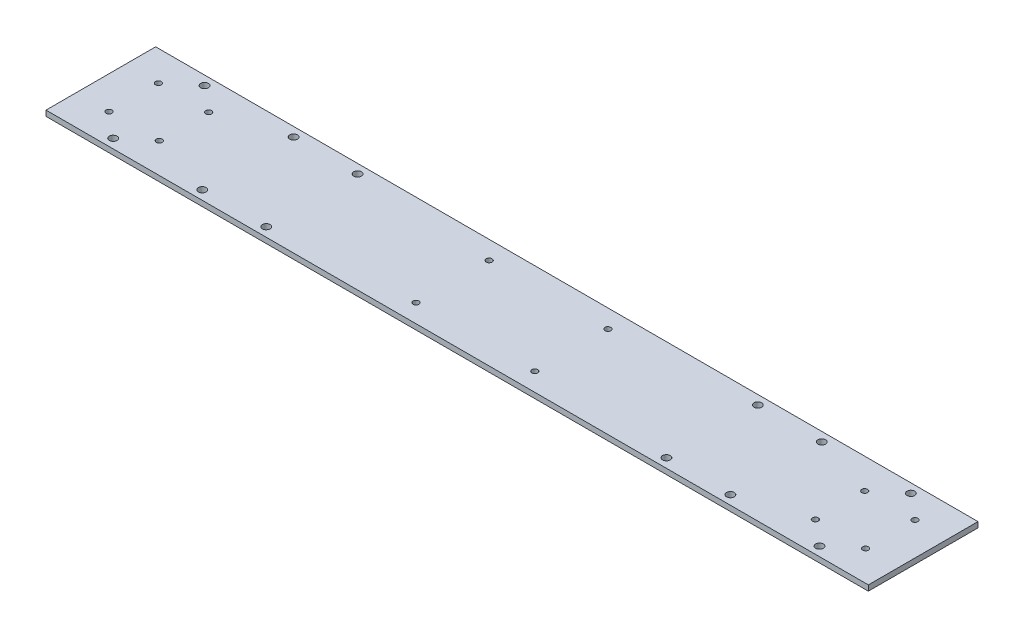
ISO-10303-21;
HEADER;
FILE_DESCRIPTION(('STEP AP214'),'2;1');
FILE_NAME('part.step','',(''),(''),'','','');
FILE_SCHEMA(('AUTOMOTIVE_DESIGN { 1 0 10303 214 1 1 1 1 }'));
ENDSEC;
DATA;
#1=APPLICATION_CONTEXT('core data for automotive mechanical design processes');
#2=APPLICATION_PROTOCOL_DEFINITION('international standard','automotive_design',2000,#1);
#3=PRODUCT_CONTEXT('',#1,'mechanical');
#4=PRODUCT('Part','Part','',(#3));
#5=PRODUCT_RELATED_PRODUCT_CATEGORY('part','',(#4));
#6=PRODUCT_DEFINITION_FORMATION('','',#4);
#7=PRODUCT_DEFINITION_CONTEXT('part definition',#1,'design');
#8=PRODUCT_DEFINITION('design','',#6,#7);
#9=PRODUCT_DEFINITION_SHAPE('','',#8);
#10=(LENGTH_UNIT() NAMED_UNIT(*) SI_UNIT(.MILLI.,.METRE.));
#11=(NAMED_UNIT(*) PLANE_ANGLE_UNIT() SI_UNIT($,.RADIAN.));
#12=(NAMED_UNIT(*) SI_UNIT($,.STERADIAN.) SOLID_ANGLE_UNIT());
#13=UNCERTAINTY_MEASURE_WITH_UNIT(LENGTH_MEASURE(1.E-05),#10,'distance_accuracy_value','');
#14=(GEOMETRIC_REPRESENTATION_CONTEXT(3) GLOBAL_UNCERTAINTY_ASSIGNED_CONTEXT((#13)) GLOBAL_UNIT_ASSIGNED_CONTEXT((#10,
#11,#12)) REPRESENTATION_CONTEXT('',''));
#15=CARTESIAN_POINT('',(0.,0.,0.));
#16=DIRECTION('',(0.,0.,1.));
#17=DIRECTION('',(1.,0.,0.));
#18=AXIS2_PLACEMENT_3D('',#15,#16,#17);
#19=CARTESIAN_POINT('',(0.,3.,-42.5));
#20=DIRECTION('',(0.,0.,-1.));
#21=DIRECTION('',(-1.,0.,0.));
#22=AXIS2_PLACEMENT_3D('',#19,#20,#21);
#23=PLANE('',#22);
#24=DIRECTION('',(1.,0.,0.));
#25=VECTOR('',#24,1.);
#26=CARTESIAN_POINT('',(0.,0.,-42.5));
#27=LINE('',#26,#25);
#28=CARTESIAN_POINT('',(-246.441364285791,0.,-42.5));
#29=VERTEX_POINT('',#28);
#30=CARTESIAN_POINT('',(203.558635714209,0.,-42.5));
#31=VERTEX_POINT('',#30);
#32=EDGE_CURVE('E103',#29,#31,#27,.T.);
#33=ORIENTED_EDGE('',*,*,#32,.T.);
#34=DIRECTION('',(0.,-1.,0.));
#35=VECTOR('',#34,1.);
#36=CARTESIAN_POINT('',(203.558635714209,3.,-42.5));
#37=LINE('',#36,#35);
#38=CARTESIAN_POINT('',(203.558635714209,3.,-42.5));
#39=VERTEX_POINT('',#38);
#40=EDGE_CURVE('E11',#39,#31,#37,.T.);
#41=ORIENTED_EDGE('',*,*,#40,.F.);
#42=DIRECTION('',(1.,0.,0.));
#43=VECTOR('',#42,1.);
#44=CARTESIAN_POINT('',(0.,3.,-42.5));
#45=LINE('',#44,#43);
#46=CARTESIAN_POINT('',(-246.441364285791,3.,-42.5));
#47=VERTEX_POINT('',#46);
#48=EDGE_CURVE('E88',#47,#39,#45,.T.);
#49=ORIENTED_EDGE('',*,*,#48,.F.);
#50=DIRECTION('',(0.,-1.,0.));
#51=VECTOR('',#50,1.);
#52=CARTESIAN_POINT('',(-246.441364285791,3.,-42.5));
#53=LINE('',#52,#51);
#54=EDGE_CURVE('E55',#47,#29,#53,.T.);
#55=ORIENTED_EDGE('',*,*,#54,.T.);
#56=EDGE_LOOP('',(#33,#41,#49,#55));
#57=FACE_BOUND('',#56,.T.);
#58=ADVANCED_FACE('F37',(#57),#23,.F.);
#59=CARTESIAN_POINT('',(203.558635714209,3.,0.));
#60=DIRECTION('',(-1.,0.,0.));
#61=DIRECTION('',(0.,0.,1.));
#62=AXIS2_PLACEMENT_3D('',#59,#60,#61);
#63=PLANE('',#62);
#64=DIRECTION('',(0.,0.,-1.));
#65=VECTOR('',#64,1.);
#66=CARTESIAN_POINT('',(203.558635714209,0.,0.));
#67=LINE('',#66,#65);
#68=CARTESIAN_POINT('',(203.558635714209,0.,-102.5));
#69=VERTEX_POINT('',#68);
#70=EDGE_CURVE('E93',#31,#69,#67,.T.);
#71=ORIENTED_EDGE('',*,*,#70,.T.);
#72=DIRECTION('',(0.,-1.,0.));
#73=VECTOR('',#72,1.);
#74=CARTESIAN_POINT('',(203.558635714209,3.,-102.5));
#75=LINE('',#74,#73);
#76=CARTESIAN_POINT('',(203.558635714209,3.,-102.5));
#77=VERTEX_POINT('',#76);
#78=EDGE_CURVE('E46',#77,#69,#75,.T.);
#79=ORIENTED_EDGE('',*,*,#78,.F.);
#80=DIRECTION('',(0.,0.,-1.));
#81=VECTOR('',#80,1.);
#82=CARTESIAN_POINT('',(203.558635714209,3.,0.));
#83=LINE('',#82,#81);
#84=EDGE_CURVE('E80',#39,#77,#83,.T.);
#85=ORIENTED_EDGE('',*,*,#84,.F.);
#86=ORIENTED_EDGE('',*,*,#40,.T.);
#87=EDGE_LOOP('',(#71,#79,#85,#86));
#88=FACE_BOUND('',#87,.T.);
#89=ADVANCED_FACE('F92',(#88),#63,.F.);
#90=CARTESIAN_POINT('',(0.,3.,-102.5));
#91=DIRECTION('',(0.,0.,-1.));
#92=DIRECTION('',(-1.,0.,0.));
#93=AXIS2_PLACEMENT_3D('',#90,#91,#92);
#94=PLANE('',#93);
#95=DIRECTION('',(1.,0.,0.));
#96=VECTOR('',#95,1.);
#97=CARTESIAN_POINT('',(0.,0.,-102.5));
#98=LINE('',#97,#96);
#99=CARTESIAN_POINT('',(-246.441364285791,0.,-102.5));
#100=VERTEX_POINT('',#99);
#101=EDGE_CURVE('E107',#100,#69,#98,.T.);
#102=ORIENTED_EDGE('',*,*,#101,.F.);
#103=DIRECTION('',(0.,-1.,0.));
#104=VECTOR('',#103,1.);
#105=CARTESIAN_POINT('',(-246.441364285791,3.,-102.5));
#106=LINE('',#105,#104);
#107=CARTESIAN_POINT('',(-246.441364285791,3.,-102.5));
#108=VERTEX_POINT('',#107);
#109=EDGE_CURVE('E69',#108,#100,#106,.T.);
#110=ORIENTED_EDGE('',*,*,#109,.F.);
#111=DIRECTION('',(1.,0.,0.));
#112=VECTOR('',#111,1.);
#113=CARTESIAN_POINT('',(0.,3.,-102.5));
#114=LINE('',#113,#112);
#115=EDGE_CURVE('E87',#108,#77,#114,.T.);
#116=ORIENTED_EDGE('',*,*,#115,.T.);
#117=ORIENTED_EDGE('',*,*,#78,.T.);
#118=EDGE_LOOP('',(#102,#110,#116,#117));
#119=FACE_BOUND('',#118,.T.);
#120=ADVANCED_FACE('F97',(#119),#94,.T.);
#121=CARTESIAN_POINT('',(-246.441364285791,3.,0.));
#122=DIRECTION('',(-1.,0.,0.));
#123=DIRECTION('',(0.,0.,1.));
#124=AXIS2_PLACEMENT_3D('',#121,#122,#123);
#125=PLANE('',#124);
#126=DIRECTION('',(0.,0.,-1.));
#127=VECTOR('',#126,1.);
#128=CARTESIAN_POINT('',(-246.441364285791,0.,0.));
#129=LINE('',#128,#127);
#130=EDGE_CURVE('E109',#29,#100,#129,.T.);
#131=ORIENTED_EDGE('',*,*,#130,.F.);
#132=ORIENTED_EDGE('',*,*,#54,.F.);
#133=DIRECTION('',(0.,0.,-1.));
#134=VECTOR('',#133,1.);
#135=CARTESIAN_POINT('',(-246.441364285791,3.,0.));
#136=LINE('',#135,#134);
#137=EDGE_CURVE('E98',#47,#108,#136,.T.);
#138=ORIENTED_EDGE('',*,*,#137,.T.);
#139=ORIENTED_EDGE('',*,*,#109,.T.);
#140=EDGE_LOOP('',(#131,#132,#138,#139));
#141=FACE_BOUND('',#140,.T.);
#142=ADVANCED_FACE('F260',(#141),#125,.T.);
#143=CARTESIAN_POINT('',(0.,3.,0.));
#144=DIRECTION('',(0.,1.,0.));
#145=DIRECTION('',(0.,0.,1.));
#146=AXIS2_PLACEMENT_3D('',#143,#144,#145);
#147=PLANE('',#146);
#148=CARTESIAN_POINT('',(11.0586357142088,3.,-92.5));
#149=DIRECTION('',(0.,1.,0.));
#150=DIRECTION('',(0.,0.,-1.));
#151=AXIS2_PLACEMENT_3D('',#148,#149,#150);
#152=CIRCLE('',#151,1.6);
#153=CARTESIAN_POINT('',(11.0586357142088,3.,-94.1));
#154=VERTEX_POINT('',#153);
#155=EDGE_CURVE('E122',#154,#154,#152,.T.);
#156=ORIENTED_EDGE('',*,*,#155,.F.);
#157=EDGE_LOOP('',(#156));
#158=FACE_BOUND('',#157,.T.);
#159=CARTESIAN_POINT('',(11.0586357142088,3.,-52.5));
#160=DIRECTION('',(0.,1.,0.));
#161=DIRECTION('',(0.,0.,1.));
#162=AXIS2_PLACEMENT_3D('',#159,#160,#161);
#163=CIRCLE('',#162,1.6);
#164=CARTESIAN_POINT('',(11.0586357142088,3.,-50.9));
#165=VERTEX_POINT('',#164);
#166=EDGE_CURVE('E538',#165,#165,#163,.T.);
#167=ORIENTED_EDGE('',*,*,#166,.F.);
#168=EDGE_LOOP('',(#167));
#169=FACE_BOUND('',#168,.T.);
#170=CARTESIAN_POINT('',(-53.9413642857912,3.,-52.5));
#171=DIRECTION('',(0.,1.,0.));
#172=DIRECTION('',(0.,0.,-1.));
#173=AXIS2_PLACEMENT_3D('',#170,#171,#172);
#174=CIRCLE('',#173,1.6);
#175=CARTESIAN_POINT('',(-53.9413642857912,3.,-54.1));
#176=VERTEX_POINT('',#175);
#177=EDGE_CURVE('E135',#176,#176,#174,.T.);
#178=ORIENTED_EDGE('',*,*,#177,.F.);
#179=EDGE_LOOP('',(#178));
#180=FACE_BOUND('',#179,.T.);
#181=CARTESIAN_POINT('',(-53.9413642857912,3.,-92.5));
#182=DIRECTION('',(0.,1.,0.));
#183=DIRECTION('',(0.,0.,1.));
#184=AXIS2_PLACEMENT_3D('',#181,#182,#183);
#185=CIRCLE('',#184,1.6);
#186=CARTESIAN_POINT('',(-53.9413642857912,3.,-90.9));
#187=VERTEX_POINT('',#186);
#188=EDGE_CURVE('E118',#187,#187,#185,.T.);
#189=ORIENTED_EDGE('',*,*,#188,.F.);
#190=EDGE_LOOP('',(#189));
#191=FACE_BOUND('',#190,.T.);
#192=CARTESIAN_POINT('',(-130.941364285791,3.,-47.5));
#193=DIRECTION('',(0.,1.,0.));
#194=DIRECTION('',(0.,0.,-1.));
#195=AXIS2_PLACEMENT_3D('',#192,#193,#194);
#196=CIRCLE('',#195,2.09999999999999);
#197=CARTESIAN_POINT('',(-130.941364285791,3.,-49.6));
#198=VERTEX_POINT('',#197);
#199=EDGE_CURVE('E161',#198,#198,#196,.T.);
#200=ORIENTED_EDGE('',*,*,#199,.F.);
#201=EDGE_LOOP('',(#200));
#202=FACE_BOUND('',#201,.T.);
#203=CARTESIAN_POINT('',(-165.941364285791,3.,-97.4999999999998));
#204=DIRECTION('',(0.,1.,0.));
#205=DIRECTION('',(0.,0.,1.));
#206=AXIS2_PLACEMENT_3D('',#203,#204,#205);
#207=CIRCLE('',#206,2.10000000000002);
#208=CARTESIAN_POINT('',(-165.941364285791,3.,-95.3999999999997));
#209=VERTEX_POINT('',#208);
#210=EDGE_CURVE('E140',#209,#209,#207,.T.);
#211=ORIENTED_EDGE('',*,*,#210,.F.);
#212=EDGE_LOOP('',(#211));
#213=FACE_BOUND('',#212,.T.);
#214=CARTESIAN_POINT('',(-214.691364285791,3.,-97.4999999999998));
#215=DIRECTION('',(0.,1.,0.));
#216=DIRECTION('',(0.,0.,1.));
#217=AXIS2_PLACEMENT_3D('',#214,#215,#216);
#218=CIRCLE('',#217,2.09999999999999);
#219=CARTESIAN_POINT('',(-214.691364285791,3.,-95.3999999999998));
#220=VERTEX_POINT('',#219);
#221=EDGE_CURVE('E141',#220,#220,#218,.T.);
#222=ORIENTED_EDGE('',*,*,#221,.F.);
#223=EDGE_LOOP('',(#222));
#224=FACE_BOUND('',#223,.T.);
#225=CARTESIAN_POINT('',(-165.941364285791,3.,-47.5000000000002));
#226=DIRECTION('',(0.,1.,0.));
#227=DIRECTION('',(0.,0.,-1.));
#228=AXIS2_PLACEMENT_3D('',#225,#226,#227);
#229=CIRCLE('',#228,2.10000000000002);
#230=CARTESIAN_POINT('',(-165.941364285791,3.,-49.6000000000003));
#231=VERTEX_POINT('',#230);
#232=EDGE_CURVE('E147',#231,#231,#229,.T.);
#233=ORIENTED_EDGE('',*,*,#232,.F.);
#234=EDGE_LOOP('',(#233));
#235=FACE_BOUND('',#234,.T.);
#236=CARTESIAN_POINT('',(-214.691364285791,3.,-47.5000000000002));
#237=DIRECTION('',(0.,1.,0.));
#238=DIRECTION('',(0.,0.,-1.));
#239=AXIS2_PLACEMENT_3D('',#236,#237,#238);
#240=CIRCLE('',#239,2.09999999999999);
#241=CARTESIAN_POINT('',(-214.691364285791,3.,-49.6000000000002));
#242=VERTEX_POINT('',#241);
#243=EDGE_CURVE('E153',#242,#242,#240,.T.);
#244=ORIENTED_EDGE('',*,*,#243,.F.);
#245=EDGE_LOOP('',(#244));
#246=FACE_BOUND('',#245,.T.);
#247=CARTESIAN_POINT('',(-228.441364285791,3.,-59.));
#248=DIRECTION('',(0.,1.,0.));
#249=DIRECTION('',(0.,0.,1.));
#250=AXIS2_PLACEMENT_3D('',#247,#248,#249);
#251=CIRCLE('',#250,1.59999999999999);
#252=CARTESIAN_POINT('',(-228.441364285791,3.,-57.4));
#253=VERTEX_POINT('',#252);
#254=EDGE_CURVE('E185',#253,#253,#251,.T.);
#255=ORIENTED_EDGE('',*,*,#254,.F.);
#256=EDGE_LOOP('',(#255));
#257=FACE_BOUND('',#256,.T.);
#258=CARTESIAN_POINT('',(-200.941364285791,3.,-86.));
#259=DIRECTION('',(0.,1.,0.));
#260=DIRECTION('',(0.,0.,1.));
#261=AXIS2_PLACEMENT_3D('',#258,#259,#260);
#262=CIRCLE('',#261,1.59999999999999);
#263=CARTESIAN_POINT('',(-200.941364285791,3.,-84.4));
#264=VERTEX_POINT('',#263);
#265=EDGE_CURVE('E172',#264,#264,#262,.T.);
#266=ORIENTED_EDGE('',*,*,#265,.F.);
#267=EDGE_LOOP('',(#266));
#268=FACE_BOUND('',#267,.T.);
#269=CARTESIAN_POINT('',(-200.941364285791,3.,-59.));
#270=DIRECTION('',(0.,1.,0.));
#271=DIRECTION('',(0.,0.,-1.));
#272=AXIS2_PLACEMENT_3D('',#269,#270,#271);
#273=CIRCLE('',#272,1.59999999999999);
#274=CARTESIAN_POINT('',(-200.941364285791,3.,-60.6));
#275=VERTEX_POINT('',#274);
#276=EDGE_CURVE('E173',#275,#275,#273,.T.);
#277=ORIENTED_EDGE('',*,*,#276,.F.);
#278=EDGE_LOOP('',(#277));
#279=FACE_BOUND('',#278,.T.);
#280=CARTESIAN_POINT('',(-130.941364285791,3.,-97.5));
#281=DIRECTION('',(0.,1.,0.));
#282=DIRECTION('',(0.,0.,1.));
#283=AXIS2_PLACEMENT_3D('',#280,#281,#282);
#284=CIRCLE('',#283,2.10000000000002);
#285=CARTESIAN_POINT('',(-130.941364285791,3.,-95.4));
#286=VERTEX_POINT('',#285);
#287=EDGE_CURVE('E160',#286,#286,#284,.T.);
#288=ORIENTED_EDGE('',*,*,#287,.F.);
#289=EDGE_LOOP('',(#288));
#290=FACE_BOUND('',#289,.T.);
#291=CARTESIAN_POINT('',(185.558635714209,3.,-86.));
#292=DIRECTION('',(0.,1.,0.));
#293=DIRECTION('',(0.,0.,-1.));
#294=AXIS2_PLACEMENT_3D('',#291,#292,#293);
#295=CIRCLE('',#294,1.59999999999999);
#296=CARTESIAN_POINT('',(185.558635714209,3.,-87.6));
#297=VERTEX_POINT('',#296);
#298=EDGE_CURVE('E117',#297,#297,#295,.T.);
#299=ORIENTED_EDGE('',*,*,#298,.F.);
#300=EDGE_LOOP('',(#299));
#301=FACE_BOUND('',#300,.T.);
#302=CARTESIAN_POINT('',(171.808635714209,3.,-97.4999999999998));
#303=DIRECTION('',(0.,1.,0.));
#304=DIRECTION('',(0.,0.,-1.));
#305=AXIS2_PLACEMENT_3D('',#302,#303,#304);
#306=CIRCLE('',#305,2.09999999999999);
#307=CARTESIAN_POINT('',(171.808635714209,3.,-99.5999999999997));
#308=VERTEX_POINT('',#307);
#309=EDGE_CURVE('E215',#308,#308,#306,.T.);
#310=ORIENTED_EDGE('',*,*,#309,.F.);
#311=EDGE_LOOP('',(#310));
#312=FACE_BOUND('',#311,.T.);
#313=CARTESIAN_POINT('',(123.058635714209,3.,-97.4999999999998));
#314=DIRECTION('',(0.,1.,0.));
#315=DIRECTION('',(0.,0.,-1.));
#316=AXIS2_PLACEMENT_3D('',#313,#314,#315);
#317=CIRCLE('',#316,2.10000000000002);
#318=CARTESIAN_POINT('',(123.058635714209,3.,-99.5999999999998));
#319=VERTEX_POINT('',#318);
#320=EDGE_CURVE('E209',#319,#319,#317,.T.);
#321=ORIENTED_EDGE('',*,*,#320,.F.);
#322=EDGE_LOOP('',(#321));
#323=FACE_BOUND('',#322,.T.);
#324=CARTESIAN_POINT('',(88.0586357142088,3.,-97.5));
#325=DIRECTION('',(0.,1.,0.));
#326=DIRECTION('',(0.,0.,-1.));
#327=AXIS2_PLACEMENT_3D('',#324,#325,#326);
#328=CIRCLE('',#327,2.10000000000002);
#329=CARTESIAN_POINT('',(88.0586357142088,3.,-99.6));
#330=VERTEX_POINT('',#329);
#331=EDGE_CURVE('E203',#330,#330,#328,.T.);
#332=ORIENTED_EDGE('',*,*,#331,.F.);
#333=EDGE_LOOP('',(#332));
#334=FACE_BOUND('',#333,.T.);
#335=CARTESIAN_POINT('',(88.0586357142088,3.,-47.5));
#336=DIRECTION('',(0.,1.,0.));
#337=DIRECTION('',(0.,0.,1.));
#338=AXIS2_PLACEMENT_3D('',#335,#336,#337);
#339=CIRCLE('',#338,2.09999999999999);
#340=CARTESIAN_POINT('',(88.0586357142088,3.,-45.4));
#341=VERTEX_POINT('',#340);
#342=EDGE_CURVE('E197',#341,#341,#339,.T.);
#343=ORIENTED_EDGE('',*,*,#342,.F.);
#344=EDGE_LOOP('',(#343));
#345=FACE_BOUND('',#344,.T.);
#346=CARTESIAN_POINT('',(158.058635714209,3.,-86.));
#347=DIRECTION('',(0.,1.,0.));
#348=DIRECTION('',(0.,0.,-1.));
#349=AXIS2_PLACEMENT_3D('',#346,#347,#348);
#350=CIRCLE('',#349,1.59999999999999);
#351=CARTESIAN_POINT('',(158.058635714209,3.,-87.6));
#352=VERTEX_POINT('',#351);
#353=EDGE_CURVE('E243',#352,#352,#350,.T.);
#354=ORIENTED_EDGE('',*,*,#353,.F.);
#355=EDGE_LOOP('',(#354));
#356=FACE_BOUND('',#355,.T.);
#357=CARTESIAN_POINT('',(171.808635714209,3.,-47.5000000000002));
#358=DIRECTION('',(0.,1.,0.));
#359=DIRECTION('',(0.,0.,1.));
#360=AXIS2_PLACEMENT_3D('',#357,#358,#359);
#361=CIRCLE('',#360,2.09999999999999);
#362=CARTESIAN_POINT('',(171.808635714209,3.,-45.4000000000002));
#363=VERTEX_POINT('',#362);
#364=EDGE_CURVE('E226',#363,#363,#361,.T.);
#365=ORIENTED_EDGE('',*,*,#364,.F.);
#366=EDGE_LOOP('',(#365));
#367=FACE_BOUND('',#366,.T.);
#368=CARTESIAN_POINT('',(185.558635714209,3.,-59.));
#369=DIRECTION('',(0.,1.,0.));
#370=DIRECTION('',(0.,0.,-1.));
#371=AXIS2_PLACEMENT_3D('',#368,#369,#370);
#372=CIRCLE('',#371,1.59999999999999);
#373=CARTESIAN_POINT('',(185.558635714209,3.,-60.6));
#374=VERTEX_POINT('',#373);
#375=EDGE_CURVE('E227',#374,#374,#372,.T.);
#376=ORIENTED_EDGE('',*,*,#375,.F.);
#377=EDGE_LOOP('',(#376));
#378=FACE_BOUND('',#377,.T.);
#379=CARTESIAN_POINT('',(158.058635714209,3.,-59.));
#380=DIRECTION('',(0.,1.,0.));
#381=DIRECTION('',(0.,0.,1.));
#382=AXIS2_PLACEMENT_3D('',#379,#380,#381);
#383=CIRCLE('',#382,1.59999999999999);
#384=CARTESIAN_POINT('',(158.058635714209,3.,-57.4));
#385=VERTEX_POINT('',#384);
#386=EDGE_CURVE('E233',#385,#385,#383,.T.);
#387=ORIENTED_EDGE('',*,*,#386,.F.);
#388=EDGE_LOOP('',(#387));
#389=FACE_BOUND('',#388,.T.);
#390=CARTESIAN_POINT('',(123.058635714209,3.,-47.5000000000002));
#391=DIRECTION('',(0.,1.,0.));
#392=DIRECTION('',(0.,0.,1.));
#393=AXIS2_PLACEMENT_3D('',#390,#391,#392);
#394=CIRCLE('',#393,2.10000000000002);
#395=CARTESIAN_POINT('',(123.058635714209,3.,-45.4000000000002));
#396=VERTEX_POINT('',#395);
#397=EDGE_CURVE('E196',#396,#396,#394,.T.);
#398=ORIENTED_EDGE('',*,*,#397,.F.);
#399=EDGE_LOOP('',(#398));
#400=FACE_BOUND('',#399,.T.);
#401=CARTESIAN_POINT('',(-228.441364285791,3.,-86.));
#402=DIRECTION('',(0.,1.,0.));
#403=DIRECTION('',(0.,0.,1.));
#404=AXIS2_PLACEMENT_3D('',#401,#402,#403);
#405=CIRCLE('',#404,1.59999999999999);
#406=CARTESIAN_POINT('',(-228.441364285791,3.,-84.4));
#407=VERTEX_POINT('',#406);
#408=EDGE_CURVE('E184',#407,#407,#405,.T.);
#409=ORIENTED_EDGE('',*,*,#408,.F.);
#410=EDGE_LOOP('',(#409));
#411=FACE_BOUND('',#410,.T.);
#412=ORIENTED_EDGE('',*,*,#48,.T.);
#413=ORIENTED_EDGE('',*,*,#84,.T.);
#414=ORIENTED_EDGE('',*,*,#115,.F.);
#415=ORIENTED_EDGE('',*,*,#137,.F.);
#416=EDGE_LOOP('',(#412,#413,#414,#415));
#417=FACE_BOUND('',#416,.T.);
#418=ADVANCED_FACE('F84',(#158,#169,#180,#191,#202,#213,#224,#235,#246,#257,#268,#279,#290,#301,
#312,#323,#334,#345,#356,#367,#378,#389,#400,#411,#417),#147,.T.);
#419=CARTESIAN_POINT('',(0.,0.,0.));
#420=DIRECTION('',(0.,1.,0.));
#421=DIRECTION('',(0.,0.,1.));
#422=AXIS2_PLACEMENT_3D('',#419,#420,#421);
#423=PLANE('',#422);
#424=CARTESIAN_POINT('',(11.0586357142088,0.,-92.5));
#425=DIRECTION('',(0.,1.,0.));
#426=DIRECTION('',(0.,0.,1.));
#427=AXIS2_PLACEMENT_3D('',#424,#425,#426);
#428=CIRCLE('',#427,1.6);
#429=CARTESIAN_POINT('',(11.0586357142088,0.,-90.9));
#430=VERTEX_POINT('',#429);
#431=EDGE_CURVE('E40',#430,#430,#428,.T.);
#432=ORIENTED_EDGE('',*,*,#431,.T.);
#433=EDGE_LOOP('',(#432));
#434=FACE_BOUND('',#433,.T.);
#435=CARTESIAN_POINT('',(11.0586357142088,0.,-52.5));
#436=DIRECTION('',(0.,1.,0.));
#437=DIRECTION('',(0.,0.,1.));
#438=AXIS2_PLACEMENT_3D('',#435,#436,#437);
#439=CIRCLE('',#438,1.6);
#440=CARTESIAN_POINT('',(11.0586357142088,0.,-50.9));
#441=VERTEX_POINT('',#440);
#442=EDGE_CURVE('E121',#441,#441,#439,.T.);
#443=ORIENTED_EDGE('',*,*,#442,.T.);
#444=EDGE_LOOP('',(#443));
#445=FACE_BOUND('',#444,.T.);
#446=CARTESIAN_POINT('',(-53.9413642857912,0.,-52.5));
#447=DIRECTION('',(0.,1.,0.));
#448=DIRECTION('',(0.,0.,1.));
#449=AXIS2_PLACEMENT_3D('',#446,#447,#448);
#450=CIRCLE('',#449,1.6);
#451=CARTESIAN_POINT('',(-53.9413642857912,0.,-50.9));
#452=VERTEX_POINT('',#451);
#453=EDGE_CURVE('E119',#452,#452,#450,.T.);
#454=ORIENTED_EDGE('',*,*,#453,.T.);
#455=EDGE_LOOP('',(#454));
#456=FACE_BOUND('',#455,.T.);
#457=CARTESIAN_POINT('',(-53.9413642857912,0.,-92.5));
#458=DIRECTION('',(0.,1.,0.));
#459=DIRECTION('',(0.,0.,1.));
#460=AXIS2_PLACEMENT_3D('',#457,#458,#459);
#461=CIRCLE('',#460,1.6);
#462=CARTESIAN_POINT('',(-53.9413642857912,0.,-90.9));
#463=VERTEX_POINT('',#462);
#464=EDGE_CURVE('E114',#463,#463,#461,.T.);
#465=ORIENTED_EDGE('',*,*,#464,.T.);
#466=EDGE_LOOP('',(#465));
#467=FACE_BOUND('',#466,.T.);
#468=CARTESIAN_POINT('',(-130.941364285791,0.,-47.5));
#469=DIRECTION('',(0.,1.,0.));
#470=DIRECTION('',(0.,0.,-1.));
#471=AXIS2_PLACEMENT_3D('',#468,#469,#470);
#472=CIRCLE('',#471,2.09999999999999);
#473=CARTESIAN_POINT('',(-130.941364285791,0.,-49.6));
#474=VERTEX_POINT('',#473);
#475=EDGE_CURVE('E157',#474,#474,#472,.T.);
#476=ORIENTED_EDGE('',*,*,#475,.T.);
#477=EDGE_LOOP('',(#476));
#478=FACE_BOUND('',#477,.T.);
#479=CARTESIAN_POINT('',(-165.941364285791,0.,-97.4999999999998));
#480=DIRECTION('',(0.,1.,0.));
#481=DIRECTION('',(0.,0.,1.));
#482=AXIS2_PLACEMENT_3D('',#479,#480,#481);
#483=CIRCLE('',#482,2.10000000000002);
#484=CARTESIAN_POINT('',(-165.941364285791,0.,-95.3999999999997));
#485=VERTEX_POINT('',#484);
#486=EDGE_CURVE('E164',#485,#485,#483,.T.);
#487=ORIENTED_EDGE('',*,*,#486,.T.);
#488=EDGE_LOOP('',(#487));
#489=FACE_BOUND('',#488,.T.);
#490=CARTESIAN_POINT('',(-214.691364285791,0.,-97.4999999999998));
#491=DIRECTION('',(0.,1.,0.));
#492=DIRECTION('',(0.,0.,1.));
#493=AXIS2_PLACEMENT_3D('',#490,#491,#492);
#494=CIRCLE('',#493,2.09999999999999);
#495=CARTESIAN_POINT('',(-214.691364285791,0.,-95.3999999999998));
#496=VERTEX_POINT('',#495);
#497=EDGE_CURVE('E137',#496,#496,#494,.T.);
#498=ORIENTED_EDGE('',*,*,#497,.T.);
#499=EDGE_LOOP('',(#498));
#500=FACE_BOUND('',#499,.T.);
#501=CARTESIAN_POINT('',(-165.941364285791,0.,-47.5000000000002));
#502=DIRECTION('',(0.,1.,0.));
#503=DIRECTION('',(0.,0.,-1.));
#504=AXIS2_PLACEMENT_3D('',#501,#502,#503);
#505=CIRCLE('',#504,2.10000000000002);
#506=CARTESIAN_POINT('',(-165.941364285791,0.,-49.6000000000003));
#507=VERTEX_POINT('',#506);
#508=EDGE_CURVE('E144',#507,#507,#505,.T.);
#509=ORIENTED_EDGE('',*,*,#508,.T.);
#510=EDGE_LOOP('',(#509));
#511=FACE_BOUND('',#510,.T.);
#512=CARTESIAN_POINT('',(-214.691364285791,0.,-47.5000000000002));
#513=DIRECTION('',(0.,1.,0.));
#514=DIRECTION('',(0.,0.,-1.));
#515=AXIS2_PLACEMENT_3D('',#512,#513,#514);
#516=CIRCLE('',#515,2.09999999999999);
#517=CARTESIAN_POINT('',(-214.691364285791,0.,-49.6000000000002));
#518=VERTEX_POINT('',#517);
#519=EDGE_CURVE('E150',#518,#518,#516,.T.);
#520=ORIENTED_EDGE('',*,*,#519,.T.);
#521=EDGE_LOOP('',(#520));
#522=FACE_BOUND('',#521,.T.);
#523=CARTESIAN_POINT('',(-228.441364285791,0.,-59.));
#524=DIRECTION('',(0.,1.,0.));
#525=DIRECTION('',(0.,0.,1.));
#526=AXIS2_PLACEMENT_3D('',#523,#524,#525);
#527=CIRCLE('',#526,1.59999999999999);
#528=CARTESIAN_POINT('',(-228.441364285791,0.,-57.4));
#529=VERTEX_POINT('',#528);
#530=EDGE_CURVE('E181',#529,#529,#527,.T.);
#531=ORIENTED_EDGE('',*,*,#530,.T.);
#532=EDGE_LOOP('',(#531));
#533=FACE_BOUND('',#532,.T.);
#534=CARTESIAN_POINT('',(-200.941364285791,0.,-86.));
#535=DIRECTION('',(0.,1.,0.));
#536=DIRECTION('',(0.,0.,1.));
#537=AXIS2_PLACEMENT_3D('',#534,#535,#536);
#538=CIRCLE('',#537,1.59999999999999);
#539=CARTESIAN_POINT('',(-200.941364285791,0.,-84.4));
#540=VERTEX_POINT('',#539);
#541=EDGE_CURVE('E188',#540,#540,#538,.T.);
#542=ORIENTED_EDGE('',*,*,#541,.T.);
#543=EDGE_LOOP('',(#542));
#544=FACE_BOUND('',#543,.T.);
#545=CARTESIAN_POINT('',(-200.941364285791,0.,-59.));
#546=DIRECTION('',(0.,1.,0.));
#547=DIRECTION('',(0.,0.,-1.));
#548=AXIS2_PLACEMENT_3D('',#545,#546,#547);
#549=CIRCLE('',#548,1.59999999999999);
#550=CARTESIAN_POINT('',(-200.941364285791,0.,-60.6));
#551=VERTEX_POINT('',#550);
#552=EDGE_CURVE('E169',#551,#551,#549,.T.);
#553=ORIENTED_EDGE('',*,*,#552,.T.);
#554=EDGE_LOOP('',(#553));
#555=FACE_BOUND('',#554,.T.);
#556=CARTESIAN_POINT('',(-130.941364285791,0.,-97.5));
#557=DIRECTION('',(0.,1.,0.));
#558=DIRECTION('',(0.,0.,1.));
#559=AXIS2_PLACEMENT_3D('',#556,#557,#558);
#560=CIRCLE('',#559,2.10000000000002);
#561=CARTESIAN_POINT('',(-130.941364285791,0.,-95.4));
#562=VERTEX_POINT('',#561);
#563=EDGE_CURVE('E176',#562,#562,#560,.T.);
#564=ORIENTED_EDGE('',*,*,#563,.T.);
#565=EDGE_LOOP('',(#564));
#566=FACE_BOUND('',#565,.T.);
#567=CARTESIAN_POINT('',(185.558635714209,0.,-86.));
#568=DIRECTION('',(0.,1.,0.));
#569=DIRECTION('',(0.,0.,-1.));
#570=AXIS2_PLACEMENT_3D('',#567,#568,#569);
#571=CIRCLE('',#570,1.59999999999999);
#572=CARTESIAN_POINT('',(185.558635714209,0.,-87.6));
#573=VERTEX_POINT('',#572);
#574=EDGE_CURVE('E218',#573,#573,#571,.T.);
#575=ORIENTED_EDGE('',*,*,#574,.T.);
#576=EDGE_LOOP('',(#575));
#577=FACE_BOUND('',#576,.T.);
#578=CARTESIAN_POINT('',(171.808635714209,0.,-97.4999999999998));
#579=DIRECTION('',(0.,1.,0.));
#580=DIRECTION('',(0.,0.,-1.));
#581=AXIS2_PLACEMENT_3D('',#578,#579,#580);
#582=CIRCLE('',#581,2.09999999999999);
#583=CARTESIAN_POINT('',(171.808635714209,0.,-99.5999999999997));
#584=VERTEX_POINT('',#583);
#585=EDGE_CURVE('E212',#584,#584,#582,.T.);
#586=ORIENTED_EDGE('',*,*,#585,.T.);
#587=EDGE_LOOP('',(#586));
#588=FACE_BOUND('',#587,.T.);
#589=CARTESIAN_POINT('',(123.058635714209,0.,-97.4999999999998));
#590=DIRECTION('',(0.,1.,0.));
#591=DIRECTION('',(0.,0.,-1.));
#592=AXIS2_PLACEMENT_3D('',#589,#590,#591);
#593=CIRCLE('',#592,2.10000000000002);
#594=CARTESIAN_POINT('',(123.058635714209,0.,-99.5999999999998));
#595=VERTEX_POINT('',#594);
#596=EDGE_CURVE('E206',#595,#595,#593,.T.);
#597=ORIENTED_EDGE('',*,*,#596,.T.);
#598=EDGE_LOOP('',(#597));
#599=FACE_BOUND('',#598,.T.);
#600=CARTESIAN_POINT('',(88.0586357142088,0.,-97.5));
#601=DIRECTION('',(0.,1.,0.));
#602=DIRECTION('',(0.,0.,-1.));
#603=AXIS2_PLACEMENT_3D('',#600,#601,#602);
#604=CIRCLE('',#603,2.10000000000002);
#605=CARTESIAN_POINT('',(88.0586357142088,0.,-99.6));
#606=VERTEX_POINT('',#605);
#607=EDGE_CURVE('E200',#606,#606,#604,.T.);
#608=ORIENTED_EDGE('',*,*,#607,.T.);
#609=EDGE_LOOP('',(#608));
#610=FACE_BOUND('',#609,.T.);
#611=CARTESIAN_POINT('',(88.0586357142088,0.,-47.5));
#612=DIRECTION('',(0.,1.,0.));
#613=DIRECTION('',(0.,0.,1.));
#614=AXIS2_PLACEMENT_3D('',#611,#612,#613);
#615=CIRCLE('',#614,2.09999999999999);
#616=CARTESIAN_POINT('',(88.0586357142088,0.,-45.4));
#617=VERTEX_POINT('',#616);
#618=EDGE_CURVE('E193',#617,#617,#615,.T.);
#619=ORIENTED_EDGE('',*,*,#618,.T.);
#620=EDGE_LOOP('',(#619));
#621=FACE_BOUND('',#620,.T.);
#622=CARTESIAN_POINT('',(158.058635714209,0.,-86.));
#623=DIRECTION('',(0.,1.,0.));
#624=DIRECTION('',(0.,0.,-1.));
#625=AXIS2_PLACEMENT_3D('',#622,#623,#624);
#626=CIRCLE('',#625,1.59999999999999);
#627=CARTESIAN_POINT('',(158.058635714209,0.,-87.6));
#628=VERTEX_POINT('',#627);
#629=EDGE_CURVE('E156',#628,#628,#626,.T.);
#630=ORIENTED_EDGE('',*,*,#629,.T.);
#631=EDGE_LOOP('',(#630));
#632=FACE_BOUND('',#631,.T.);
#633=CARTESIAN_POINT('',(171.808635714209,0.,-47.5000000000002));
#634=DIRECTION('',(0.,1.,0.));
#635=DIRECTION('',(0.,0.,1.));
#636=AXIS2_PLACEMENT_3D('',#633,#634,#635);
#637=CIRCLE('',#636,2.09999999999999);
#638=CARTESIAN_POINT('',(171.808635714209,0.,-45.4000000000002));
#639=VERTEX_POINT('',#638);
#640=EDGE_CURVE('E246',#639,#639,#637,.T.);
#641=ORIENTED_EDGE('',*,*,#640,.T.);
#642=EDGE_LOOP('',(#641));
#643=FACE_BOUND('',#642,.T.);
#644=CARTESIAN_POINT('',(185.558635714209,0.,-59.));
#645=DIRECTION('',(0.,1.,0.));
#646=DIRECTION('',(0.,0.,-1.));
#647=AXIS2_PLACEMENT_3D('',#644,#645,#646);
#648=CIRCLE('',#647,1.59999999999999);
#649=CARTESIAN_POINT('',(185.558635714209,0.,-60.6));
#650=VERTEX_POINT('',#649);
#651=EDGE_CURVE('E223',#650,#650,#648,.T.);
#652=ORIENTED_EDGE('',*,*,#651,.T.);
#653=EDGE_LOOP('',(#652));
#654=FACE_BOUND('',#653,.T.);
#655=CARTESIAN_POINT('',(158.058635714209,0.,-59.));
#656=DIRECTION('',(0.,1.,0.));
#657=DIRECTION('',(0.,0.,1.));
#658=AXIS2_PLACEMENT_3D('',#655,#656,#657);
#659=CIRCLE('',#658,1.59999999999999);
#660=CARTESIAN_POINT('',(158.058635714209,0.,-57.4));
#661=VERTEX_POINT('',#660);
#662=EDGE_CURVE('E230',#661,#661,#659,.T.);
#663=ORIENTED_EDGE('',*,*,#662,.T.);
#664=EDGE_LOOP('',(#663));
#665=FACE_BOUND('',#664,.T.);
#666=CARTESIAN_POINT('',(123.058635714209,0.,-47.5000000000002));
#667=DIRECTION('',(0.,1.,0.));
#668=DIRECTION('',(0.,0.,1.));
#669=AXIS2_PLACEMENT_3D('',#666,#667,#668);
#670=CIRCLE('',#669,2.10000000000002);
#671=CARTESIAN_POINT('',(123.058635714209,0.,-45.4000000000002));
#672=VERTEX_POINT('',#671);
#673=EDGE_CURVE('E236',#672,#672,#670,.T.);
#674=ORIENTED_EDGE('',*,*,#673,.T.);
#675=EDGE_LOOP('',(#674));
#676=FACE_BOUND('',#675,.T.);
#677=CARTESIAN_POINT('',(-228.441364285791,0.,-86.));
#678=DIRECTION('',(0.,1.,0.));
#679=DIRECTION('',(0.,0.,1.));
#680=AXIS2_PLACEMENT_3D('',#677,#678,#679);
#681=CIRCLE('',#680,1.59999999999999);
#682=CARTESIAN_POINT('',(-228.441364285791,0.,-84.4));
#683=VERTEX_POINT('',#682);
#684=EDGE_CURVE('E105',#683,#683,#681,.T.);
#685=ORIENTED_EDGE('',*,*,#684,.T.);
#686=EDGE_LOOP('',(#685));
#687=FACE_BOUND('',#686,.T.);
#688=ORIENTED_EDGE('',*,*,#32,.F.);
#689=ORIENTED_EDGE('',*,*,#130,.T.);
#690=ORIENTED_EDGE('',*,*,#101,.T.);
#691=ORIENTED_EDGE('',*,*,#70,.F.);
#692=EDGE_LOOP('',(#688,#689,#690,#691));
#693=FACE_BOUND('',#692,.T.);
#694=ADVANCED_FACE('F259',(#434,#445,#456,#467,#478,#489,#500,#511,#522,#533,#544,#555,#566,
#577,#588,#599,#610,#621,#632,#643,#654,#665,#676,#687,#693),#423,.F.);
#695=CARTESIAN_POINT('',(-228.441364285791,0.,-86.));
#696=DIRECTION('',(0.,1.,0.));
#697=DIRECTION('',(0.,0.,1.));
#698=AXIS2_PLACEMENT_3D('',#695,#696,#697);
#699=CYLINDRICAL_SURFACE('',#698,1.59999999999999);
#700=ORIENTED_EDGE('',*,*,#684,.F.);
#701=EDGE_LOOP('',(#700));
#702=FACE_BOUND('',#701,.T.);
#703=ORIENTED_EDGE('',*,*,#408,.T.);
#704=EDGE_LOOP('',(#703));
#705=FACE_BOUND('',#704,.T.);
#706=ADVANCED_FACE('F256',(#702,#705),#699,.F.);
#707=CARTESIAN_POINT('',(123.058635714209,0.,-47.5000000000002));
#708=DIRECTION('',(0.,1.,0.));
#709=DIRECTION('',(0.,0.,1.));
#710=AXIS2_PLACEMENT_3D('',#707,#708,#709);
#711=CYLINDRICAL_SURFACE('',#710,2.10000000000002);
#712=ORIENTED_EDGE('',*,*,#673,.F.);
#713=EDGE_LOOP('',(#712));
#714=FACE_BOUND('',#713,.T.);
#715=ORIENTED_EDGE('',*,*,#397,.T.);
#716=EDGE_LOOP('',(#715));
#717=FACE_BOUND('',#716,.T.);
#718=ADVANCED_FACE('F306',(#714,#717),#711,.F.);
#719=CARTESIAN_POINT('',(158.058635714209,0.,-59.));
#720=DIRECTION('',(0.,1.,0.));
#721=DIRECTION('',(0.,0.,1.));
#722=AXIS2_PLACEMENT_3D('',#719,#720,#721);
#723=CYLINDRICAL_SURFACE('',#722,1.59999999999999);
#724=ORIENTED_EDGE('',*,*,#662,.F.);
#725=EDGE_LOOP('',(#724));
#726=FACE_BOUND('',#725,.T.);
#727=ORIENTED_EDGE('',*,*,#386,.T.);
#728=EDGE_LOOP('',(#727));
#729=FACE_BOUND('',#728,.T.);
#730=ADVANCED_FACE('F312',(#726,#729),#723,.F.);
#731=CARTESIAN_POINT('',(185.558635714209,0.,-59.));
#732=DIRECTION('',(0.,1.,0.));
#733=DIRECTION('',(0.,0.,1.));
#734=AXIS2_PLACEMENT_3D('',#731,#732,#733);
#735=CYLINDRICAL_SURFACE('',#734,1.59999999999999);
#736=ORIENTED_EDGE('',*,*,#651,.F.);
#737=EDGE_LOOP('',(#736));
#738=FACE_BOUND('',#737,.T.);
#739=ORIENTED_EDGE('',*,*,#375,.T.);
#740=EDGE_LOOP('',(#739));
#741=FACE_BOUND('',#740,.T.);
#742=ADVANCED_FACE('F320',(#738,#741),#735,.F.);
#743=CARTESIAN_POINT('',(171.808635714209,0.,-47.5000000000002));
#744=DIRECTION('',(0.,1.,0.));
#745=DIRECTION('',(0.,0.,1.));
#746=AXIS2_PLACEMENT_3D('',#743,#744,#745);
#747=CYLINDRICAL_SURFACE('',#746,2.09999999999999);
#748=ORIENTED_EDGE('',*,*,#640,.F.);
#749=EDGE_LOOP('',(#748));
#750=FACE_BOUND('',#749,.T.);
#751=ORIENTED_EDGE('',*,*,#364,.T.);
#752=EDGE_LOOP('',(#751));
#753=FACE_BOUND('',#752,.T.);
#754=ADVANCED_FACE('F328',(#750,#753),#747,.F.);
#755=CARTESIAN_POINT('',(158.058635714209,0.,-86.));
#756=DIRECTION('',(0.,1.,0.));
#757=DIRECTION('',(0.,0.,1.));
#758=AXIS2_PLACEMENT_3D('',#755,#756,#757);
#759=CYLINDRICAL_SURFACE('',#758,1.59999999999999);
#760=ORIENTED_EDGE('',*,*,#629,.F.);
#761=EDGE_LOOP('',(#760));
#762=FACE_BOUND('',#761,.T.);
#763=ORIENTED_EDGE('',*,*,#353,.T.);
#764=EDGE_LOOP('',(#763));
#765=FACE_BOUND('',#764,.T.);
#766=ADVANCED_FACE('F336',(#762,#765),#759,.F.);
#767=CARTESIAN_POINT('',(88.0586357142088,0.,-47.5));
#768=DIRECTION('',(0.,1.,0.));
#769=DIRECTION('',(0.,0.,1.));
#770=AXIS2_PLACEMENT_3D('',#767,#768,#769);
#771=CYLINDRICAL_SURFACE('',#770,2.09999999999999);
#772=ORIENTED_EDGE('',*,*,#618,.F.);
#773=EDGE_LOOP('',(#772));
#774=FACE_BOUND('',#773,.T.);
#775=ORIENTED_EDGE('',*,*,#342,.T.);
#776=EDGE_LOOP('',(#775));
#777=FACE_BOUND('',#776,.T.);
#778=ADVANCED_FACE('F344',(#774,#777),#771,.F.);
#779=CARTESIAN_POINT('',(88.0586357142088,0.,-97.5));
#780=DIRECTION('',(0.,1.,0.));
#781=DIRECTION('',(0.,0.,1.));
#782=AXIS2_PLACEMENT_3D('',#779,#780,#781);
#783=CYLINDRICAL_SURFACE('',#782,2.10000000000002);
#784=ORIENTED_EDGE('',*,*,#607,.F.);
#785=EDGE_LOOP('',(#784));
#786=FACE_BOUND('',#785,.T.);
#787=ORIENTED_EDGE('',*,*,#331,.T.);
#788=EDGE_LOOP('',(#787));
#789=FACE_BOUND('',#788,.T.);
#790=ADVANCED_FACE('F352',(#786,#789),#783,.F.);
#791=CARTESIAN_POINT('',(123.058635714209,0.,-97.4999999999998));
#792=DIRECTION('',(0.,1.,0.));
#793=DIRECTION('',(0.,0.,1.));
#794=AXIS2_PLACEMENT_3D('',#791,#792,#793);
#795=CYLINDRICAL_SURFACE('',#794,2.10000000000002);
#796=ORIENTED_EDGE('',*,*,#596,.F.);
#797=EDGE_LOOP('',(#796));
#798=FACE_BOUND('',#797,.T.);
#799=ORIENTED_EDGE('',*,*,#320,.T.);
#800=EDGE_LOOP('',(#799));
#801=FACE_BOUND('',#800,.T.);
#802=ADVANCED_FACE('F360',(#798,#801),#795,.F.);
#803=CARTESIAN_POINT('',(171.808635714209,0.,-97.4999999999998));
#804=DIRECTION('',(0.,1.,0.));
#805=DIRECTION('',(0.,0.,1.));
#806=AXIS2_PLACEMENT_3D('',#803,#804,#805);
#807=CYLINDRICAL_SURFACE('',#806,2.09999999999999);
#808=ORIENTED_EDGE('',*,*,#585,.F.);
#809=EDGE_LOOP('',(#808));
#810=FACE_BOUND('',#809,.T.);
#811=ORIENTED_EDGE('',*,*,#309,.T.);
#812=EDGE_LOOP('',(#811));
#813=FACE_BOUND('',#812,.T.);
#814=ADVANCED_FACE('F368',(#810,#813),#807,.F.);
#815=CARTESIAN_POINT('',(185.558635714209,0.,-86.));
#816=DIRECTION('',(0.,1.,0.));
#817=DIRECTION('',(0.,0.,1.));
#818=AXIS2_PLACEMENT_3D('',#815,#816,#817);
#819=CYLINDRICAL_SURFACE('',#818,1.59999999999999);
#820=ORIENTED_EDGE('',*,*,#574,.F.);
#821=EDGE_LOOP('',(#820));
#822=FACE_BOUND('',#821,.T.);
#823=ORIENTED_EDGE('',*,*,#298,.T.);
#824=EDGE_LOOP('',(#823));
#825=FACE_BOUND('',#824,.T.);
#826=ADVANCED_FACE('F376',(#822,#825),#819,.F.);
#827=CARTESIAN_POINT('',(-130.941364285791,0.,-97.5));
#828=DIRECTION('',(0.,1.,0.));
#829=DIRECTION('',(0.,0.,1.));
#830=AXIS2_PLACEMENT_3D('',#827,#828,#829);
#831=CYLINDRICAL_SURFACE('',#830,2.10000000000002);
#832=ORIENTED_EDGE('',*,*,#563,.F.);
#833=EDGE_LOOP('',(#832));
#834=FACE_BOUND('',#833,.T.);
#835=ORIENTED_EDGE('',*,*,#287,.T.);
#836=EDGE_LOOP('',(#835));
#837=FACE_BOUND('',#836,.T.);
#838=ADVANCED_FACE('F384',(#834,#837),#831,.F.);
#839=CARTESIAN_POINT('',(-200.941364285791,0.,-59.));
#840=DIRECTION('',(0.,1.,0.));
#841=DIRECTION('',(0.,0.,1.));
#842=AXIS2_PLACEMENT_3D('',#839,#840,#841);
#843=CYLINDRICAL_SURFACE('',#842,1.59999999999999);
#844=ORIENTED_EDGE('',*,*,#552,.F.);
#845=EDGE_LOOP('',(#844));
#846=FACE_BOUND('',#845,.T.);
#847=ORIENTED_EDGE('',*,*,#276,.T.);
#848=EDGE_LOOP('',(#847));
#849=FACE_BOUND('',#848,.T.);
#850=ADVANCED_FACE('F392',(#846,#849),#843,.F.);
#851=CARTESIAN_POINT('',(-200.941364285791,0.,-86.));
#852=DIRECTION('',(0.,1.,0.));
#853=DIRECTION('',(0.,0.,1.));
#854=AXIS2_PLACEMENT_3D('',#851,#852,#853);
#855=CYLINDRICAL_SURFACE('',#854,1.59999999999999);
#856=ORIENTED_EDGE('',*,*,#541,.F.);
#857=EDGE_LOOP('',(#856));
#858=FACE_BOUND('',#857,.T.);
#859=ORIENTED_EDGE('',*,*,#265,.T.);
#860=EDGE_LOOP('',(#859));
#861=FACE_BOUND('',#860,.T.);
#862=ADVANCED_FACE('F400',(#858,#861),#855,.F.);
#863=CARTESIAN_POINT('',(-228.441364285791,0.,-59.));
#864=DIRECTION('',(0.,1.,0.));
#865=DIRECTION('',(0.,0.,1.));
#866=AXIS2_PLACEMENT_3D('',#863,#864,#865);
#867=CYLINDRICAL_SURFACE('',#866,1.59999999999999);
#868=ORIENTED_EDGE('',*,*,#530,.F.);
#869=EDGE_LOOP('',(#868));
#870=FACE_BOUND('',#869,.T.);
#871=ORIENTED_EDGE('',*,*,#254,.T.);
#872=EDGE_LOOP('',(#871));
#873=FACE_BOUND('',#872,.T.);
#874=ADVANCED_FACE('F408',(#870,#873),#867,.F.);
#875=CARTESIAN_POINT('',(-214.691364285791,0.,-47.5000000000002));
#876=DIRECTION('',(0.,1.,0.));
#877=DIRECTION('',(0.,0.,1.));
#878=AXIS2_PLACEMENT_3D('',#875,#876,#877);
#879=CYLINDRICAL_SURFACE('',#878,2.09999999999999);
#880=ORIENTED_EDGE('',*,*,#519,.F.);
#881=EDGE_LOOP('',(#880));
#882=FACE_BOUND('',#881,.T.);
#883=ORIENTED_EDGE('',*,*,#243,.T.);
#884=EDGE_LOOP('',(#883));
#885=FACE_BOUND('',#884,.T.);
#886=ADVANCED_FACE('F416',(#882,#885),#879,.F.);
#887=CARTESIAN_POINT('',(-165.941364285791,0.,-47.5000000000002));
#888=DIRECTION('',(0.,1.,0.));
#889=DIRECTION('',(0.,0.,1.));
#890=AXIS2_PLACEMENT_3D('',#887,#888,#889);
#891=CYLINDRICAL_SURFACE('',#890,2.10000000000002);
#892=ORIENTED_EDGE('',*,*,#508,.F.);
#893=EDGE_LOOP('',(#892));
#894=FACE_BOUND('',#893,.T.);
#895=ORIENTED_EDGE('',*,*,#232,.T.);
#896=EDGE_LOOP('',(#895));
#897=FACE_BOUND('',#896,.T.);
#898=ADVANCED_FACE('F424',(#894,#897),#891,.F.);
#899=CARTESIAN_POINT('',(-214.691364285791,0.,-97.4999999999998));
#900=DIRECTION('',(0.,1.,0.));
#901=DIRECTION('',(0.,0.,1.));
#902=AXIS2_PLACEMENT_3D('',#899,#900,#901);
#903=CYLINDRICAL_SURFACE('',#902,2.09999999999999);
#904=ORIENTED_EDGE('',*,*,#497,.F.);
#905=EDGE_LOOP('',(#904));
#906=FACE_BOUND('',#905,.T.);
#907=ORIENTED_EDGE('',*,*,#221,.T.);
#908=EDGE_LOOP('',(#907));
#909=FACE_BOUND('',#908,.T.);
#910=ADVANCED_FACE('F432',(#906,#909),#903,.F.);
#911=CARTESIAN_POINT('',(-165.941364285791,0.,-97.4999999999998));
#912=DIRECTION('',(0.,1.,0.));
#913=DIRECTION('',(0.,0.,1.));
#914=AXIS2_PLACEMENT_3D('',#911,#912,#913);
#915=CYLINDRICAL_SURFACE('',#914,2.10000000000002);
#916=ORIENTED_EDGE('',*,*,#486,.F.);
#917=EDGE_LOOP('',(#916));
#918=FACE_BOUND('',#917,.T.);
#919=ORIENTED_EDGE('',*,*,#210,.T.);
#920=EDGE_LOOP('',(#919));
#921=FACE_BOUND('',#920,.T.);
#922=ADVANCED_FACE('F440',(#918,#921),#915,.F.);
#923=CARTESIAN_POINT('',(-130.941364285791,0.,-47.5));
#924=DIRECTION('',(0.,1.,0.));
#925=DIRECTION('',(0.,0.,1.));
#926=AXIS2_PLACEMENT_3D('',#923,#924,#925);
#927=CYLINDRICAL_SURFACE('',#926,2.09999999999999);
#928=ORIENTED_EDGE('',*,*,#475,.F.);
#929=EDGE_LOOP('',(#928));
#930=FACE_BOUND('',#929,.T.);
#931=ORIENTED_EDGE('',*,*,#199,.T.);
#932=EDGE_LOOP('',(#931));
#933=FACE_BOUND('',#932,.T.);
#934=ADVANCED_FACE('F448',(#930,#933),#927,.F.);
#935=CARTESIAN_POINT('',(-53.9413642857912,-7.,-92.5));
#936=DIRECTION('',(0.,1.,0.));
#937=DIRECTION('',(0.,0.,1.));
#938=AXIS2_PLACEMENT_3D('',#935,#936,#937);
#939=CYLINDRICAL_SURFACE('',#938,1.6);
#940=ORIENTED_EDGE('',*,*,#188,.T.);
#941=EDGE_LOOP('',(#940));
#942=FACE_BOUND('',#941,.T.);
#943=ORIENTED_EDGE('',*,*,#464,.F.);
#944=EDGE_LOOP('',(#943));
#945=FACE_BOUND('',#944,.T.);
#946=ADVANCED_FACE('F455',(#942,#945),#939,.F.);
#947=CARTESIAN_POINT('',(-53.9413642857912,-7.,-52.5));
#948=DIRECTION('',(0.,1.,0.));
#949=DIRECTION('',(0.,0.,1.));
#950=AXIS2_PLACEMENT_3D('',#947,#948,#949);
#951=CYLINDRICAL_SURFACE('',#950,1.6);
#952=ORIENTED_EDGE('',*,*,#177,.T.);
#953=EDGE_LOOP('',(#952));
#954=FACE_BOUND('',#953,.T.);
#955=ORIENTED_EDGE('',*,*,#453,.F.);
#956=EDGE_LOOP('',(#955));
#957=FACE_BOUND('',#956,.T.);
#958=ADVANCED_FACE('F462',(#954,#957),#951,.F.);
#959=CARTESIAN_POINT('',(11.0586357142088,-7.,-52.5));
#960=DIRECTION('',(0.,1.,0.));
#961=DIRECTION('',(0.,0.,1.));
#962=AXIS2_PLACEMENT_3D('',#959,#960,#961);
#963=CYLINDRICAL_SURFACE('',#962,1.6);
#964=ORIENTED_EDGE('',*,*,#166,.T.);
#965=EDGE_LOOP('',(#964));
#966=FACE_BOUND('',#965,.T.);
#967=ORIENTED_EDGE('',*,*,#442,.F.);
#968=EDGE_LOOP('',(#967));
#969=FACE_BOUND('',#968,.T.);
#970=ADVANCED_FACE('F469',(#966,#969),#963,.F.);
#971=CARTESIAN_POINT('',(11.0586357142088,-7.,-92.5));
#972=DIRECTION('',(0.,1.,0.));
#973=DIRECTION('',(0.,0.,1.));
#974=AXIS2_PLACEMENT_3D('',#971,#972,#973);
#975=CYLINDRICAL_SURFACE('',#974,1.6);
#976=ORIENTED_EDGE('',*,*,#155,.T.);
#977=EDGE_LOOP('',(#976));
#978=FACE_BOUND('',#977,.T.);
#979=ORIENTED_EDGE('',*,*,#431,.F.);
#980=EDGE_LOOP('',(#979));
#981=FACE_BOUND('',#980,.T.);
#982=ADVANCED_FACE('F477',(#978,#981),#975,.F.);
#983=CLOSED_SHELL('',(#58,#89,#120,#142,#418,#694,#706,#718,#730,#742,#754,#766,#778,#790,#802,
#814,#826,#838,#850,#862,#874,#886,#898,#910,#922,#934,#946,#958,#970,#982));
#984=MANIFOLD_SOLID_BREP('B2',#983);
#985=ADVANCED_BREP_SHAPE_REPRESENTATION('',(#18,#984),#14);
#986=SHAPE_DEFINITION_REPRESENTATION(#9,#985);
ENDSEC;
END-ISO-10303-21;
